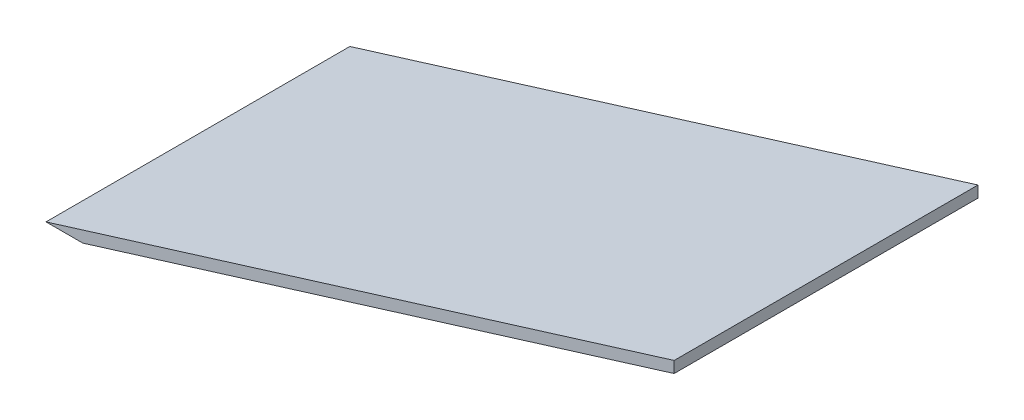
ISO-10303-21;
HEADER;
FILE_DESCRIPTION(('STEP AP214'),'2;1');
FILE_NAME('part.step','',(''),(''),'','','');
FILE_SCHEMA(('AUTOMOTIVE_DESIGN { 1 0 10303 214 1 1 1 1 }'));
ENDSEC;
DATA;
#1=APPLICATION_CONTEXT('core data for automotive mechanical design processes');
#2=APPLICATION_PROTOCOL_DEFINITION('international standard','automotive_design',2000,#1);
#3=PRODUCT_CONTEXT('',#1,'mechanical');
#4=PRODUCT('Part','Part','',(#3));
#5=PRODUCT_RELATED_PRODUCT_CATEGORY('part','',(#4));
#6=PRODUCT_DEFINITION_FORMATION('','',#4);
#7=PRODUCT_DEFINITION_CONTEXT('part definition',#1,'design');
#8=PRODUCT_DEFINITION('design','',#6,#7);
#9=PRODUCT_DEFINITION_SHAPE('','',#8);
#10=(LENGTH_UNIT() NAMED_UNIT(*) SI_UNIT(.MILLI.,.METRE.));
#11=(NAMED_UNIT(*) PLANE_ANGLE_UNIT() SI_UNIT($,.RADIAN.));
#12=(NAMED_UNIT(*) SI_UNIT($,.STERADIAN.) SOLID_ANGLE_UNIT());
#13=UNCERTAINTY_MEASURE_WITH_UNIT(LENGTH_MEASURE(1.E-05),#10,'distance_accuracy_value','');
#14=(GEOMETRIC_REPRESENTATION_CONTEXT(3) GLOBAL_UNCERTAINTY_ASSIGNED_CONTEXT((#13)) GLOBAL_UNIT_ASSIGNED_CONTEXT((#10,
#11,#12)) REPRESENTATION_CONTEXT('',''));
#15=CARTESIAN_POINT('',(0.,0.,0.));
#16=DIRECTION('',(0.,0.,1.));
#17=DIRECTION('',(1.,0.,0.));
#18=AXIS2_PLACEMENT_3D('',#15,#16,#17);
#19=CARTESIAN_POINT('',(59.2793626397788,0.,490.));
#20=DIRECTION('',(0.,1.,0.));
#21=DIRECTION('',(-1.,0.,0.));
#22=AXIS2_PLACEMENT_3D('',#19,#20,#21);
#23=PLANE('',#22);
#24=DIRECTION('',(1.,0.,0.));
#25=VECTOR('',#24,1.);
#26=CARTESIAN_POINT('',(59.2793626397788,0.,0.));
#27=LINE('',#26,#25);
#28=CARTESIAN_POINT('',(0.,0.,0.));
#29=VERTEX_POINT('',#28);
#30=CARTESIAN_POINT('',(59.2793626397788,0.,0.));
#31=VERTEX_POINT('',#30);
#32=EDGE_CURVE('E100',#29,#31,#27,.T.);
#33=ORIENTED_EDGE('',*,*,#32,.T.);
#34=DIRECTION('',(0.,0.,-1.));
#35=VECTOR('',#34,1.);
#36=CARTESIAN_POINT('',(59.2793626397788,0.,490.));
#37=LINE('',#36,#35);
#38=CARTESIAN_POINT('',(59.2793626397788,0.,490.));
#39=VERTEX_POINT('',#38);
#40=EDGE_CURVE('E11',#39,#31,#37,.T.);
#41=ORIENTED_EDGE('',*,*,#40,.F.);
#42=DIRECTION('',(1.,0.,0.));
#43=VECTOR('',#42,1.);
#44=CARTESIAN_POINT('',(59.2793626397788,0.,490.));
#45=LINE('',#44,#43);
#46=CARTESIAN_POINT('',(0.,0.,490.));
#47=VERTEX_POINT('',#46);
#48=EDGE_CURVE('E88',#47,#39,#45,.T.);
#49=ORIENTED_EDGE('',*,*,#48,.F.);
#50=DIRECTION('',(0.,0.,-1.));
#51=VECTOR('',#50,1.);
#52=CARTESIAN_POINT('',(0.,0.,490.));
#53=LINE('',#52,#51);
#54=EDGE_CURVE('E96',#47,#29,#53,.T.);
#55=ORIENTED_EDGE('',*,*,#54,.T.);
#56=EDGE_LOOP('',(#33,#41,#49,#55));
#57=FACE_BOUND('',#56,.T.);
#58=ADVANCED_FACE('F37',(#57),#23,.F.);
#59=CARTESIAN_POINT('',(59.2793626397788,0.,490.));
#60=DIRECTION('',(-0.295212350819993,0.955431665752885,0.));
#61=DIRECTION('',(-0.955431665752885,-0.295212350819993,0.));
#62=AXIS2_PLACEMENT_3D('',#59,#60,#61);
#63=PLANE('',#62);
#64=DIRECTION('',(0.955431665752885,0.295212350819993,0.));
#65=VECTOR('',#64,1.);
#66=CARTESIAN_POINT('',(59.2793626397788,0.,0.));
#67=LINE('',#66,#65);
#68=CARTESIAN_POINT('',(1013.,294.683671760858,0.));
#69=VERTEX_POINT('',#68);
#70=EDGE_CURVE('E92',#31,#69,#67,.T.);
#71=ORIENTED_EDGE('',*,*,#70,.T.);
#72=DIRECTION('',(0.,0.,-1.));
#73=VECTOR('',#72,1.);
#74=CARTESIAN_POINT('',(1013.,294.683671760858,490.));
#75=LINE('',#74,#73);
#76=CARTESIAN_POINT('',(1013.,294.683671760858,490.));
#77=VERTEX_POINT('',#76);
#78=EDGE_CURVE('E45',#77,#69,#75,.T.);
#79=ORIENTED_EDGE('',*,*,#78,.F.);
#80=DIRECTION('',(0.955431665752885,0.295212350819993,0.));
#81=VECTOR('',#80,1.);
#82=CARTESIAN_POINT('',(59.2793626397788,0.,490.));
#83=LINE('',#82,#81);
#84=EDGE_CURVE('E83',#39,#77,#83,.T.);
#85=ORIENTED_EDGE('',*,*,#84,.F.);
#86=ORIENTED_EDGE('',*,*,#40,.T.);
#87=EDGE_LOOP('',(#71,#79,#85,#86));
#88=FACE_BOUND('',#87,.T.);
#89=ADVANCED_FACE('F91',(#88),#63,.F.);
#90=CARTESIAN_POINT('',(1013.,294.683671760858,490.));
#91=DIRECTION('',(-1.,0.,0.));
#92=DIRECTION('',(0.,0.,1.));
#93=AXIS2_PLACEMENT_3D('',#90,#91,#92);
#94=PLANE('',#93);
#95=DIRECTION('',(0.,1.,0.));
#96=VECTOR('',#95,1.);
#97=CARTESIAN_POINT('',(1013.,294.683671760858,0.));
#98=LINE('',#97,#96);
#99=CARTESIAN_POINT('',(1013.,313.,0.));
#100=VERTEX_POINT('',#99);
#101=EDGE_CURVE('E70',#69,#100,#98,.T.);
#102=ORIENTED_EDGE('',*,*,#101,.T.);
#103=DIRECTION('',(0.,0.,-1.));
#104=VECTOR('',#103,1.);
#105=CARTESIAN_POINT('',(1013.,313.,490.));
#106=LINE('',#105,#104);
#107=CARTESIAN_POINT('',(1013.,313.,490.));
#108=VERTEX_POINT('',#107);
#109=EDGE_CURVE('E93',#108,#100,#106,.T.);
#110=ORIENTED_EDGE('',*,*,#109,.F.);
#111=DIRECTION('',(0.,1.,0.));
#112=VECTOR('',#111,1.);
#113=CARTESIAN_POINT('',(1013.,294.683671760858,490.));
#114=LINE('',#113,#112);
#115=EDGE_CURVE('E86',#77,#108,#114,.T.);
#116=ORIENTED_EDGE('',*,*,#115,.F.);
#117=ORIENTED_EDGE('',*,*,#78,.T.);
#118=EDGE_LOOP('',(#102,#110,#116,#117));
#119=FACE_BOUND('',#118,.T.);
#120=ADVANCED_FACE('F94',(#119),#94,.F.);
#121=CARTESIAN_POINT('',(0.,0.,490.));
#122=DIRECTION('',(0.295212350819993,-0.955431665752885,0.));
#123=DIRECTION('',(0.955431665752885,0.295212350819993,0.));
#124=AXIS2_PLACEMENT_3D('',#121,#122,#123);
#125=PLANE('',#124);
#126=DIRECTION('',(-0.955431665752885,-0.295212350819993,0.));
#127=VECTOR('',#126,1.);
#128=CARTESIAN_POINT('',(0.,0.,0.));
#129=LINE('',#128,#127);
#130=EDGE_CURVE('E76',#100,#29,#129,.T.);
#131=ORIENTED_EDGE('',*,*,#130,.T.);
#132=ORIENTED_EDGE('',*,*,#54,.F.);
#133=DIRECTION('',(-0.955431665752885,-0.295212350819993,0.));
#134=VECTOR('',#133,1.);
#135=CARTESIAN_POINT('',(0.,0.,490.));
#136=LINE('',#135,#134);
#137=EDGE_CURVE('E53',#108,#47,#136,.T.);
#138=ORIENTED_EDGE('',*,*,#137,.F.);
#139=ORIENTED_EDGE('',*,*,#109,.T.);
#140=EDGE_LOOP('',(#131,#132,#138,#139));
#141=FACE_BOUND('',#140,.T.);
#142=ADVANCED_FACE('F107',(#141),#125,.F.);
#143=CARTESIAN_POINT('',(0.,0.,490.));
#144=DIRECTION('',(0.,0.,-1.));
#145=DIRECTION('',(-1.,0.,0.));
#146=AXIS2_PLACEMENT_3D('',#143,#144,#145);
#147=PLANE('',#146);
#148=ORIENTED_EDGE('',*,*,#48,.T.);
#149=ORIENTED_EDGE('',*,*,#84,.T.);
#150=ORIENTED_EDGE('',*,*,#115,.T.);
#151=ORIENTED_EDGE('',*,*,#137,.T.);
#152=EDGE_LOOP('',(#148,#149,#150,#151));
#153=FACE_BOUND('',#152,.T.);
#154=ADVANCED_FACE('F84',(#153),#147,.F.);
#155=CARTESIAN_POINT('',(0.,0.,0.));
#156=DIRECTION('',(0.,0.,-1.));
#157=DIRECTION('',(-1.,0.,0.));
#158=AXIS2_PLACEMENT_3D('',#155,#156,#157);
#159=PLANE('',#158);
#160=ORIENTED_EDGE('',*,*,#32,.F.);
#161=ORIENTED_EDGE('',*,*,#130,.F.);
#162=ORIENTED_EDGE('',*,*,#101,.F.);
#163=ORIENTED_EDGE('',*,*,#70,.F.);
#164=EDGE_LOOP('',(#160,#161,#162,#163));
#165=FACE_BOUND('',#164,.T.);
#166=ADVANCED_FACE('F110',(#165),#159,.T.);
#167=CLOSED_SHELL('',(#58,#89,#120,#142,#154,#166));
#168=MANIFOLD_SOLID_BREP('B2',#167);
#169=ADVANCED_BREP_SHAPE_REPRESENTATION('',(#18,#168),#14);
#170=SHAPE_DEFINITION_REPRESENTATION(#9,#169);
ENDSEC;
END-ISO-10303-21;
